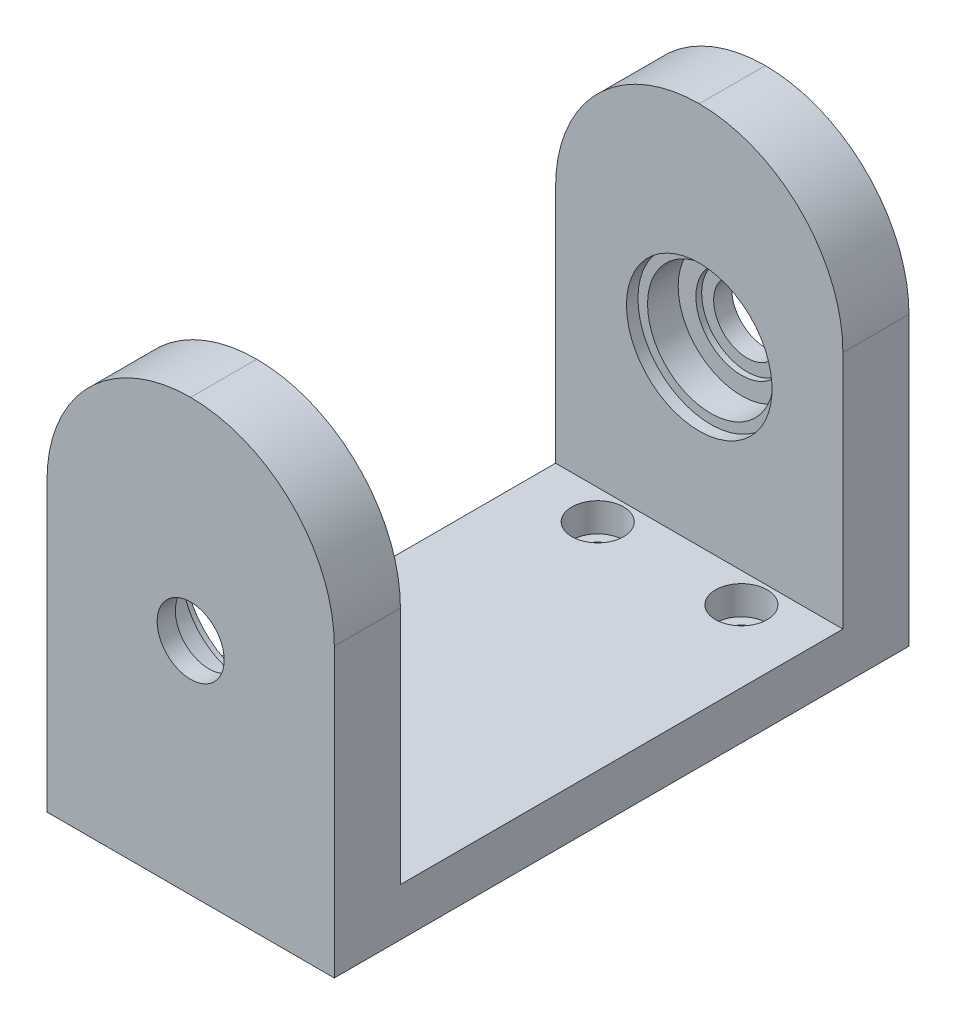
ISO-10303-21;
HEADER;
FILE_DESCRIPTION(('STEP AP214'),'2;1');
FILE_NAME('part.step','',(''),(''),'','','');
FILE_SCHEMA(('AUTOMOTIVE_DESIGN { 1 0 10303 214 1 1 1 1 }'));
ENDSEC;
DATA;
#1=APPLICATION_CONTEXT('core data for automotive mechanical design processes');
#2=APPLICATION_PROTOCOL_DEFINITION('international standard','automotive_design',2000,#1);
#3=PRODUCT_CONTEXT('',#1,'mechanical');
#4=PRODUCT('Part','Part','',(#3));
#5=PRODUCT_RELATED_PRODUCT_CATEGORY('part','',(#4));
#6=PRODUCT_DEFINITION_FORMATION('','',#4);
#7=PRODUCT_DEFINITION_CONTEXT('part definition',#1,'design');
#8=PRODUCT_DEFINITION('design','',#6,#7);
#9=PRODUCT_DEFINITION_SHAPE('','',#8);
#10=(LENGTH_UNIT() NAMED_UNIT(*) SI_UNIT(.MILLI.,.METRE.));
#11=(NAMED_UNIT(*) PLANE_ANGLE_UNIT() SI_UNIT($,.RADIAN.));
#12=(NAMED_UNIT(*) SI_UNIT($,.STERADIAN.) SOLID_ANGLE_UNIT());
#13=UNCERTAINTY_MEASURE_WITH_UNIT(LENGTH_MEASURE(1.E-05),#10,'distance_accuracy_value','');
#14=(GEOMETRIC_REPRESENTATION_CONTEXT(3) GLOBAL_UNCERTAINTY_ASSIGNED_CONTEXT((#13)) GLOBAL_UNIT_ASSIGNED_CONTEXT((#10,
#11,#12)) REPRESENTATION_CONTEXT('',''));
#15=CARTESIAN_POINT('',(0.,0.,0.));
#16=DIRECTION('',(0.,0.,1.));
#17=DIRECTION('',(1.,0.,0.));
#18=AXIS2_PLACEMENT_3D('',#15,#16,#17);
#19=CARTESIAN_POINT('',(-15.04416518748,12.7381812931289,2.68139476480281));
#20=DIRECTION('',(0.,1.,0.));
#21=DIRECTION('',(0.,0.,1.));
#22=AXIS2_PLACEMENT_3D('',#19,#20,#21);
#23=PLANE('',#22);
#24=CARTESIAN_POINT('',(-7.54416518748003,12.7381812931289,-17.3186052351972));
#25=DIRECTION('',(0.,1.,0.));
#26=DIRECTION('',(0.,0.,1.));
#27=AXIS2_PLACEMENT_3D('',#24,#25,#26);
#28=CIRCLE('',#27,2.7);
#29=CARTESIAN_POINT('',(-7.54416518748003,12.7381812931289,-14.6186052351972));
#30=VERTEX_POINT('',#29);
#31=EDGE_CURVE('E163',#30,#30,#28,.T.);
#32=ORIENTED_EDGE('',*,*,#31,.F.);
#33=EDGE_LOOP('',(#32));
#34=FACE_BOUND('',#33,.T.);
#35=CARTESIAN_POINT('',(-22.54416518748,12.7381812931289,22.6813947648028));
#36=DIRECTION('',(0.,1.,0.));
#37=DIRECTION('',(0.,0.,1.));
#38=AXIS2_PLACEMENT_3D('',#35,#36,#37);
#39=CIRCLE('',#38,2.7);
#40=CARTESIAN_POINT('',(-22.54416518748,12.7381812931289,25.3813947648028));
#41=VERTEX_POINT('',#40);
#42=EDGE_CURVE('E156',#41,#41,#39,.T.);
#43=ORIENTED_EDGE('',*,*,#42,.F.);
#44=EDGE_LOOP('',(#43));
#45=FACE_BOUND('',#44,.T.);
#46=CARTESIAN_POINT('',(-7.54416518748004,12.7381812931289,22.6813947648028));
#47=DIRECTION('',(0.,1.,0.));
#48=DIRECTION('',(0.,0.,1.));
#49=AXIS2_PLACEMENT_3D('',#46,#47,#48);
#50=CIRCLE('',#49,2.7);
#51=CARTESIAN_POINT('',(-7.54416518748004,12.7381812931289,25.3813947648028));
#52=VERTEX_POINT('',#51);
#53=EDGE_CURVE('E149',#52,#52,#50,.T.);
#54=ORIENTED_EDGE('',*,*,#53,.F.);
#55=EDGE_LOOP('',(#54));
#56=FACE_BOUND('',#55,.T.);
#57=CARTESIAN_POINT('',(-22.54416518748,12.7381812931289,-17.3186052351972));
#58=DIRECTION('',(0.,1.,0.));
#59=DIRECTION('',(0.,0.,1.));
#60=AXIS2_PLACEMENT_3D('',#57,#58,#59);
#61=CIRCLE('',#60,2.7);
#62=CARTESIAN_POINT('',(-22.54416518748,12.7381812931289,-14.6186052351972));
#63=VERTEX_POINT('',#62);
#64=EDGE_CURVE('E162',#63,#63,#61,.T.);
#65=ORIENTED_EDGE('',*,*,#64,.F.);
#66=EDGE_LOOP('',(#65));
#67=FACE_BOUND('',#66,.T.);
#68=DIRECTION('',(0.,0.,-1.));
#69=VECTOR('',#68,1.);
#70=CARTESIAN_POINT('',(-0.0441651874800303,12.7381812931289,32.6813947648028));
#71=LINE('',#70,#69);
#72=CARTESIAN_POINT('',(-0.0441651874800303,12.7381812931289,25.7813947648028));
#73=VERTEX_POINT('',#72);
#74=CARTESIAN_POINT('',(-0.0441651874800303,12.7381812931289,-20.4186052351972));
#75=VERTEX_POINT('',#74);
#76=EDGE_CURVE('E142',#73,#75,#71,.T.);
#77=ORIENTED_EDGE('',*,*,#76,.T.);
#78=DIRECTION('',(1.,0.,0.));
#79=VECTOR('',#78,1.);
#80=CARTESIAN_POINT('',(-30.04416518748,12.7381812931289,-20.4186052351972));
#81=LINE('',#80,#79);
#82=CARTESIAN_POINT('',(-30.04416518748,12.7381812931289,-20.4186052351972));
#83=VERTEX_POINT('',#82);
#84=EDGE_CURVE('E141',#83,#75,#81,.T.);
#85=ORIENTED_EDGE('',*,*,#84,.F.);
#86=DIRECTION('',(0.,0.,1.));
#87=VECTOR('',#86,1.);
#88=CARTESIAN_POINT('',(-30.04416518748,12.7381812931289,32.6813947648028));
#89=LINE('',#88,#87);
#90=CARTESIAN_POINT('',(-30.04416518748,12.7381812931289,25.7813947648028));
#91=VERTEX_POINT('',#90);
#92=EDGE_CURVE('E128',#83,#91,#89,.T.);
#93=ORIENTED_EDGE('',*,*,#92,.T.);
#94=DIRECTION('',(1.,0.,0.));
#95=VECTOR('',#94,1.);
#96=CARTESIAN_POINT('',(-30.04416518748,12.7381812931289,25.7813947648028));
#97=LINE('',#96,#95);
#98=EDGE_CURVE('E133',#91,#73,#97,.T.);
#99=ORIENTED_EDGE('',*,*,#98,.T.);
#100=EDGE_LOOP('',(#77,#85,#93,#99));
#101=FACE_BOUND('',#100,.T.);
#102=ADVANCED_FACE('F45',(#34,#45,#56,#67,#101),#23,.T.);
#103=CARTESIAN_POINT('',(-22.54416518748,12.7381812931289,-17.3186052351972));
#104=DIRECTION('',(0.,-1.,0.));
#105=DIRECTION('',(0.,0.,-1.));
#106=AXIS2_PLACEMENT_3D('',#103,#104,#105);
#107=CYLINDRICAL_SURFACE('',#106,1.65);
#108=CARTESIAN_POINT('',(-22.54416518748,7.73818129312892,-17.3186052351972));
#109=DIRECTION('',(0.,1.,0.));
#110=DIRECTION('',(0.,0.,1.));
#111=AXIS2_PLACEMENT_3D('',#108,#109,#110);
#112=CIRCLE('',#111,1.65);
#113=CARTESIAN_POINT('',(-22.54416518748,7.73818129312892,-15.6686052351972));
#114=VERTEX_POINT('',#113);
#115=EDGE_CURVE('E187',#114,#114,#112,.T.);
#116=ORIENTED_EDGE('',*,*,#115,.F.);
#117=EDGE_LOOP('',(#116));
#118=FACE_BOUND('',#117,.T.);
#119=CARTESIAN_POINT('',(-22.54416518748,9.73818129312892,-17.3186052351972));
#120=DIRECTION('',(0.,1.,0.));
#121=DIRECTION('',(0.,0.,1.));
#122=AXIS2_PLACEMENT_3D('',#119,#120,#121);
#123=CIRCLE('',#122,1.65);
#124=CARTESIAN_POINT('',(-22.54416518748,9.73818129312892,-15.6686052351972));
#125=VERTEX_POINT('',#124);
#126=EDGE_CURVE('E181',#125,#125,#123,.T.);
#127=ORIENTED_EDGE('',*,*,#126,.T.);
#128=EDGE_LOOP('',(#127));
#129=FACE_BOUND('',#128,.T.);
#130=ADVANCED_FACE('F349',(#118,#129),#107,.F.);
#131=CARTESIAN_POINT('',(-7.54416518748003,12.7381812931289,-17.3186052351972));
#132=DIRECTION('',(0.,-1.,0.));
#133=DIRECTION('',(0.,0.,-1.));
#134=AXIS2_PLACEMENT_3D('',#131,#132,#133);
#135=CYLINDRICAL_SURFACE('',#134,1.65);
#136=CARTESIAN_POINT('',(-7.54416518748003,7.73818129312892,-17.3186052351972));
#137=DIRECTION('',(0.,1.,0.));
#138=DIRECTION('',(0.,0.,-1.));
#139=AXIS2_PLACEMENT_3D('',#136,#137,#138);
#140=CIRCLE('',#139,1.65);
#141=CARTESIAN_POINT('',(-7.54416518748003,7.73818129312892,-18.9686052351972));
#142=VERTEX_POINT('',#141);
#143=EDGE_CURVE('E184',#142,#142,#140,.T.);
#144=ORIENTED_EDGE('',*,*,#143,.F.);
#145=EDGE_LOOP('',(#144));
#146=FACE_BOUND('',#145,.T.);
#147=CARTESIAN_POINT('',(-7.54416518748003,9.73818129312892,-17.3186052351972));
#148=DIRECTION('',(0.,1.,0.));
#149=DIRECTION('',(0.,0.,1.));
#150=AXIS2_PLACEMENT_3D('',#147,#148,#149);
#151=CIRCLE('',#150,1.65);
#152=CARTESIAN_POINT('',(-7.54416518748003,9.73818129312892,-15.6686052351972));
#153=VERTEX_POINT('',#152);
#154=EDGE_CURVE('E216',#153,#153,#151,.T.);
#155=ORIENTED_EDGE('',*,*,#154,.T.);
#156=EDGE_LOOP('',(#155));
#157=FACE_BOUND('',#156,.T.);
#158=ADVANCED_FACE('F355',(#146,#157),#135,.F.);
#159=CARTESIAN_POINT('',(-7.54416518748004,12.7381812931289,22.6813947648028));
#160=DIRECTION('',(0.,-1.,0.));
#161=DIRECTION('',(0.,0.,-1.));
#162=AXIS2_PLACEMENT_3D('',#159,#160,#161);
#163=CYLINDRICAL_SURFACE('',#162,1.65);
#164=CARTESIAN_POINT('',(-7.54416518748004,7.73818129312892,22.6813947648028));
#165=DIRECTION('',(0.,1.,0.));
#166=DIRECTION('',(0.,0.,1.));
#167=AXIS2_PLACEMENT_3D('',#164,#165,#166);
#168=CIRCLE('',#167,1.65);
#169=CARTESIAN_POINT('',(-7.54416518748004,7.73818129312892,24.3313947648028));
#170=VERTEX_POINT('',#169);
#171=EDGE_CURVE('E180',#170,#170,#168,.T.);
#172=ORIENTED_EDGE('',*,*,#171,.F.);
#173=EDGE_LOOP('',(#172));
#174=FACE_BOUND('',#173,.T.);
#175=CARTESIAN_POINT('',(-7.54416518748004,9.73818129312892,22.6813947648028));
#176=DIRECTION('',(0.,1.,0.));
#177=DIRECTION('',(0.,0.,1.));
#178=AXIS2_PLACEMENT_3D('',#175,#176,#177);
#179=CIRCLE('',#178,1.65);
#180=CARTESIAN_POINT('',(-7.54416518748004,9.73818129312892,24.3313947648028));
#181=VERTEX_POINT('',#180);
#182=EDGE_CURVE('E213',#181,#181,#179,.T.);
#183=ORIENTED_EDGE('',*,*,#182,.T.);
#184=EDGE_LOOP('',(#183));
#185=FACE_BOUND('',#184,.T.);
#186=ADVANCED_FACE('F705',(#174,#185),#163,.F.);
#187=CARTESIAN_POINT('',(-22.54416518748,12.7381812931289,22.6813947648028));
#188=DIRECTION('',(0.,-1.,0.));
#189=DIRECTION('',(0.,0.,-1.));
#190=AXIS2_PLACEMENT_3D('',#187,#188,#189);
#191=CYLINDRICAL_SURFACE('',#190,1.65);
#192=CARTESIAN_POINT('',(-22.54416518748,7.73818129312892,22.6813947648028));
#193=DIRECTION('',(0.,1.,0.));
#194=DIRECTION('',(0.,0.,-1.));
#195=AXIS2_PLACEMENT_3D('',#192,#193,#194);
#196=CIRCLE('',#195,1.65);
#197=CARTESIAN_POINT('',(-22.54416518748,7.73818129312892,21.0313947648028));
#198=VERTEX_POINT('',#197);
#199=EDGE_CURVE('E177',#198,#198,#196,.T.);
#200=ORIENTED_EDGE('',*,*,#199,.F.);
#201=EDGE_LOOP('',(#200));
#202=FACE_BOUND('',#201,.T.);
#203=CARTESIAN_POINT('',(-22.54416518748,9.73818129312892,22.6813947648028));
#204=DIRECTION('',(0.,1.,0.));
#205=DIRECTION('',(0.,0.,1.));
#206=AXIS2_PLACEMENT_3D('',#203,#204,#205);
#207=CIRCLE('',#206,1.65);
#208=CARTESIAN_POINT('',(-22.54416518748,9.73818129312892,24.3313947648028));
#209=VERTEX_POINT('',#208);
#210=EDGE_CURVE('E174',#209,#209,#207,.T.);
#211=ORIENTED_EDGE('',*,*,#210,.T.);
#212=EDGE_LOOP('',(#211));
#213=FACE_BOUND('',#212,.T.);
#214=ADVANCED_FACE('F365',(#202,#213),#191,.F.);
#215=CARTESIAN_POINT('',(-15.04416518748,7.73818129312892,2.68139476480281));
#216=DIRECTION('',(0.,1.,0.));
#217=DIRECTION('',(0.,0.,1.));
#218=AXIS2_PLACEMENT_3D('',#215,#216,#217);
#219=PLANE('',#218);
#220=DIRECTION('',(0.,0.,1.));
#221=VECTOR('',#220,1.);
#222=CARTESIAN_POINT('',(-30.04416518748,7.73818129312892,32.6813947648028));
#223=LINE('',#222,#221);
#224=CARTESIAN_POINT('',(-30.04416518748,7.73818129312892,-27.3186052351972));
#225=VERTEX_POINT('',#224);
#226=CARTESIAN_POINT('',(-30.04416518748,7.73818129312892,32.6813947648028));
#227=VERTEX_POINT('',#226);
#228=EDGE_CURVE('E189',#225,#227,#223,.T.);
#229=ORIENTED_EDGE('',*,*,#228,.F.);
#230=DIRECTION('',(-1.,0.,0.));
#231=VECTOR('',#230,1.);
#232=CARTESIAN_POINT('',(-0.0441651874800303,7.73818129312892,-27.3186052351972));
#233=LINE('',#232,#231);
#234=CARTESIAN_POINT('',(-0.0441651874800303,7.73818129312892,-27.3186052351972));
#235=VERTEX_POINT('',#234);
#236=EDGE_CURVE('E143',#235,#225,#233,.T.);
#237=ORIENTED_EDGE('',*,*,#236,.F.);
#238=DIRECTION('',(0.,0.,-1.));
#239=VECTOR('',#238,1.);
#240=CARTESIAN_POINT('',(-0.0441651874800303,7.73818129312892,32.6813947648028));
#241=LINE('',#240,#239);
#242=CARTESIAN_POINT('',(-0.0441651874800303,7.73818129312892,32.6813947648028));
#243=VERTEX_POINT('',#242);
#244=EDGE_CURVE('E198',#243,#235,#241,.T.);
#245=ORIENTED_EDGE('',*,*,#244,.F.);
#246=DIRECTION('',(1.,0.,0.));
#247=VECTOR('',#246,1.);
#248=CARTESIAN_POINT('',(-0.0441651874800303,7.73818129312892,32.6813947648028));
#249=LINE('',#248,#247);
#250=EDGE_CURVE('E195',#227,#243,#249,.T.);
#251=ORIENTED_EDGE('',*,*,#250,.F.);
#252=EDGE_LOOP('',(#229,#237,#245,#251));
#253=FACE_BOUND('',#252,.T.);
#254=ORIENTED_EDGE('',*,*,#115,.T.);
#255=EDGE_LOOP('',(#254));
#256=FACE_BOUND('',#255,.T.);
#257=ORIENTED_EDGE('',*,*,#143,.T.);
#258=EDGE_LOOP('',(#257));
#259=FACE_BOUND('',#258,.T.);
#260=ORIENTED_EDGE('',*,*,#171,.T.);
#261=EDGE_LOOP('',(#260));
#262=FACE_BOUND('',#261,.T.);
#263=ORIENTED_EDGE('',*,*,#199,.T.);
#264=EDGE_LOOP('',(#263));
#265=FACE_BOUND('',#264,.T.);
#266=ADVANCED_FACE('F362',(#253,#256,#259,#262,#265),#219,.F.);
#267=CARTESIAN_POINT('',(-30.04416518748,12.7381812931289,32.6813947648028));
#268=DIRECTION('',(1.,0.,0.));
#269=DIRECTION('',(0.,0.,-1.));
#270=AXIS2_PLACEMENT_3D('',#267,#268,#269);
#271=PLANE('',#270);
#272=DIRECTION('',(0.,-1.,0.));
#273=VECTOR('',#272,1.);
#274=CARTESIAN_POINT('',(-30.04416518748,12.7381812931289,-20.4186052351972));
#275=LINE('',#274,#273);
#276=CARTESIAN_POINT('',(-30.04416518748,37.7381812931289,-20.4186052351972));
#277=VERTEX_POINT('',#276);
#278=EDGE_CURVE('E307',#277,#83,#275,.T.);
#279=ORIENTED_EDGE('',*,*,#278,.F.);
#280=DIRECTION('',(0.,0.,-1.));
#281=VECTOR('',#280,1.);
#282=CARTESIAN_POINT('',(-30.04416518748,37.7381812931289,32.6813947648028));
#283=LINE('',#282,#281);
#284=CARTESIAN_POINT('',(-30.04416518748,37.7381812931289,-27.3186052351972));
#285=VERTEX_POINT('',#284);
#286=EDGE_CURVE('E234',#277,#285,#283,.T.);
#287=ORIENTED_EDGE('',*,*,#286,.T.);
#288=DIRECTION('',(0.,-1.,0.));
#289=VECTOR('',#288,1.);
#290=CARTESIAN_POINT('',(-30.04416518748,12.7381812931289,-27.3186052351972));
#291=LINE('',#290,#289);
#292=EDGE_CURVE('E192',#285,#225,#291,.T.);
#293=ORIENTED_EDGE('',*,*,#292,.T.);
#294=ORIENTED_EDGE('',*,*,#228,.T.);
#295=DIRECTION('',(0.,-1.,0.));
#296=VECTOR('',#295,1.);
#297=CARTESIAN_POINT('',(-30.04416518748,12.7381812931289,32.6813947648028));
#298=LINE('',#297,#296);
#299=CARTESIAN_POINT('',(-30.04416518748,37.7381812931289,32.6813947648028));
#300=VERTEX_POINT('',#299);
#301=EDGE_CURVE('E208',#300,#227,#298,.T.);
#302=ORIENTED_EDGE('',*,*,#301,.F.);
#303=DIRECTION('',(0.,0.,1.));
#304=VECTOR('',#303,1.);
#305=CARTESIAN_POINT('',(-30.04416518748,37.7381812931289,25.7813947648028));
#306=LINE('',#305,#304);
#307=CARTESIAN_POINT('',(-30.04416518748,37.7381812931289,25.7813947648028));
#308=VERTEX_POINT('',#307);
#309=EDGE_CURVE('E131',#300,#308,#306,.F.);
#310=ORIENTED_EDGE('',*,*,#309,.T.);
#311=DIRECTION('',(0.,-1.,0.));
#312=VECTOR('',#311,1.);
#313=CARTESIAN_POINT('',(-30.04416518748,12.7381812931289,25.7813947648028));
#314=LINE('',#313,#312);
#315=EDGE_CURVE('E124',#308,#91,#314,.T.);
#316=ORIENTED_EDGE('',*,*,#315,.T.);
#317=ORIENTED_EDGE('',*,*,#92,.F.);
#318=EDGE_LOOP('',(#279,#287,#293,#294,#302,#310,#316,#317));
#319=FACE_BOUND('',#318,.T.);
#320=ADVANCED_FACE('F127',(#319),#271,.F.);
#321=CARTESIAN_POINT('',(-0.0441651874800303,12.7381812931289,32.6813947648028));
#322=DIRECTION('',(0.,0.,-1.));
#323=DIRECTION('',(-1.,0.,0.));
#324=AXIS2_PLACEMENT_3D('',#321,#322,#323);
#325=PLANE('',#324);
#326=CARTESIAN_POINT('',(-15.04416518748,30.7381812931289,32.6813947648028));
#327=DIRECTION('',(0.,0.,-1.));
#328=DIRECTION('',(-1.,0.,0.));
#329=AXIS2_PLACEMENT_3D('',#326,#327,#328);
#330=CIRCLE('',#329,3.5);
#331=CARTESIAN_POINT('',(-18.54416518748,30.7381812931289,32.6813947648028));
#332=VERTEX_POINT('',#331);
#333=EDGE_CURVE('E254',#332,#332,#330,.T.);
#334=ORIENTED_EDGE('',*,*,#333,.T.);
#335=EDGE_LOOP('',(#334));
#336=FACE_BOUND('',#335,.T.);
#337=CARTESIAN_POINT('',(-15.04416518748,37.7381812931289,32.6813947648028));
#338=DIRECTION('',(0.,0.,-1.));
#339=DIRECTION('',(-1.,0.,0.));
#340=AXIS2_PLACEMENT_3D('',#337,#338,#339);
#341=CIRCLE('',#340,15.);
#342=CARTESIAN_POINT('',(-0.0441651874800303,37.7381812931289,32.6813947648028));
#343=VERTEX_POINT('',#342);
#344=CARTESIAN_POINT('',(-15.04416518748,52.7381812931289,32.6813947648028));
#345=VERTEX_POINT('',#344);
#346=EDGE_CURVE('E69',#343,#345,#341,.F.);
#347=ORIENTED_EDGE('',*,*,#346,.T.);
#348=CARTESIAN_POINT('',(-15.04416518748,37.7381812931289,32.6813947648028));
#349=DIRECTION('',(0.,0.,-1.));
#350=DIRECTION('',(-1.,0.,0.));
#351=AXIS2_PLACEMENT_3D('',#348,#349,#350);
#352=CIRCLE('',#351,15.);
#353=EDGE_CURVE('E237',#345,#300,#352,.F.);
#354=ORIENTED_EDGE('',*,*,#353,.T.);
#355=ORIENTED_EDGE('',*,*,#301,.T.);
#356=ORIENTED_EDGE('',*,*,#250,.T.);
#357=DIRECTION('',(0.,-1.,0.));
#358=VECTOR('',#357,1.);
#359=CARTESIAN_POINT('',(-0.0441651874800303,12.7381812931289,32.6813947648028));
#360=LINE('',#359,#358);
#361=EDGE_CURVE('E206',#343,#243,#360,.T.);
#362=ORIENTED_EDGE('',*,*,#361,.F.);
#363=EDGE_LOOP('',(#347,#354,#355,#356,#362));
#364=FACE_BOUND('',#363,.T.);
#365=ADVANCED_FACE('F373',(#336,#364),#325,.F.);
#366=CARTESIAN_POINT('',(-0.0441651874800303,12.7381812931289,32.6813947648028));
#367=DIRECTION('',(-1.,0.,0.));
#368=DIRECTION('',(0.,0.,1.));
#369=AXIS2_PLACEMENT_3D('',#366,#367,#368);
#370=PLANE('',#369);
#371=DIRECTION('',(0.,-1.,0.));
#372=VECTOR('',#371,1.);
#373=CARTESIAN_POINT('',(-0.0441651874800303,12.7381812931289,-27.3186052351972));
#374=LINE('',#373,#372);
#375=CARTESIAN_POINT('',(-0.0441651874800303,37.7381812931289,-27.3186052351972));
#376=VERTEX_POINT('',#375);
#377=EDGE_CURVE('E204',#376,#235,#374,.T.);
#378=ORIENTED_EDGE('',*,*,#377,.F.);
#379=DIRECTION('',(0.,0.,-1.));
#380=VECTOR('',#379,1.);
#381=CARTESIAN_POINT('',(-0.0441651874800303,37.7381812931289,32.6813947648028));
#382=LINE('',#381,#380);
#383=CARTESIAN_POINT('',(-0.0441651874800303,37.7381812931289,-20.4186052351972));
#384=VERTEX_POINT('',#383);
#385=EDGE_CURVE('E226',#376,#384,#382,.F.);
#386=ORIENTED_EDGE('',*,*,#385,.T.);
#387=DIRECTION('',(0.,1.,0.));
#388=VECTOR('',#387,1.);
#389=CARTESIAN_POINT('',(-0.0441651874800303,32.7381812931289,-20.4186052351972));
#390=LINE('',#389,#388);
#391=EDGE_CURVE('E311',#75,#384,#390,.T.);
#392=ORIENTED_EDGE('',*,*,#391,.F.);
#393=ORIENTED_EDGE('',*,*,#76,.F.);
#394=DIRECTION('',(0.,1.,0.));
#395=VECTOR('',#394,1.);
#396=CARTESIAN_POINT('',(-0.0441651874800303,12.7381812931289,25.7813947648028));
#397=LINE('',#396,#395);
#398=CARTESIAN_POINT('',(-0.0441651874800303,37.7381812931289,25.7813947648028));
#399=VERTEX_POINT('',#398);
#400=EDGE_CURVE('E147',#73,#399,#397,.T.);
#401=ORIENTED_EDGE('',*,*,#400,.T.);
#402=DIRECTION('',(0.,0.,1.));
#403=VECTOR('',#402,1.);
#404=CARTESIAN_POINT('',(-0.0441651874800303,37.7381812931289,32.6813947648028));
#405=LINE('',#404,#403);
#406=EDGE_CURVE('E224',#399,#343,#405,.T.);
#407=ORIENTED_EDGE('',*,*,#406,.T.);
#408=ORIENTED_EDGE('',*,*,#361,.T.);
#409=ORIENTED_EDGE('',*,*,#244,.T.);
#410=EDGE_LOOP('',(#378,#386,#392,#393,#401,#407,#408,#409));
#411=FACE_BOUND('',#410,.T.);
#412=ADVANCED_FACE('F370',(#411),#370,.F.);
#413=CARTESIAN_POINT('',(-0.0441651874800303,12.7381812931289,-27.3186052351972));
#414=DIRECTION('',(0.,0.,1.));
#415=DIRECTION('',(1.,0.,0.));
#416=AXIS2_PLACEMENT_3D('',#413,#414,#415);
#417=PLANE('',#416);
#418=CARTESIAN_POINT('',(-24.56916518748,30.7381812931289,-27.3186052351972));
#419=DIRECTION('',(0.,0.,1.));
#420=DIRECTION('',(1.,0.,0.));
#421=AXIS2_PLACEMENT_3D('',#418,#419,#420);
#422=CIRCLE('',#421,1.95);
#423=CARTESIAN_POINT('',(-22.61916518748,30.7381812931289,-27.3186052351972));
#424=VERTEX_POINT('',#423);
#425=EDGE_CURVE('E54',#424,#424,#422,.T.);
#426=ORIENTED_EDGE('',*,*,#425,.T.);
#427=EDGE_LOOP('',(#426));
#428=FACE_BOUND('',#427,.T.);
#429=CARTESIAN_POINT('',(-5.51916518748003,30.7381812931289,-27.3186052351972));
#430=DIRECTION('',(0.,0.,1.));
#431=DIRECTION('',(1.,0.,0.));
#432=AXIS2_PLACEMENT_3D('',#429,#430,#431);
#433=CIRCLE('',#432,1.95);
#434=CARTESIAN_POINT('',(-3.56916518748003,30.7381812931289,-27.3186052351972));
#435=VERTEX_POINT('',#434);
#436=EDGE_CURVE('E257',#435,#435,#433,.T.);
#437=ORIENTED_EDGE('',*,*,#436,.T.);
#438=EDGE_LOOP('',(#437));
#439=FACE_BOUND('',#438,.T.);
#440=CARTESIAN_POINT('',(-15.04416518748,30.7381812931289,-27.3186052351972));
#441=DIRECTION('',(0.,0.,-1.));
#442=DIRECTION('',(-1.,0.,0.));
#443=AXIS2_PLACEMENT_3D('',#440,#441,#442);
#444=CIRCLE('',#443,3.5);
#445=CARTESIAN_POINT('',(-18.54416518748,30.7381812931289,-27.3186052351972));
#446=VERTEX_POINT('',#445);
#447=EDGE_CURVE('E283',#446,#446,#444,.T.);
#448=ORIENTED_EDGE('',*,*,#447,.F.);
#449=EDGE_LOOP('',(#448));
#450=FACE_BOUND('',#449,.T.);
#451=CARTESIAN_POINT('',(-15.04416518748,37.7381812931289,-27.3186052351972));
#452=DIRECTION('',(0.,0.,1.));
#453=DIRECTION('',(1.,0.,0.));
#454=AXIS2_PLACEMENT_3D('',#451,#452,#453);
#455=CIRCLE('',#454,15.);
#456=CARTESIAN_POINT('',(-15.04416518748,52.7381812931289,-27.3186052351972));
#457=VERTEX_POINT('',#456);
#458=EDGE_CURVE('E210',#285,#457,#455,.F.);
#459=ORIENTED_EDGE('',*,*,#458,.T.);
#460=CARTESIAN_POINT('',(-15.04416518748,37.7381812931289,-27.3186052351972));
#461=DIRECTION('',(0.,0.,1.));
#462=DIRECTION('',(1.,0.,0.));
#463=AXIS2_PLACEMENT_3D('',#460,#461,#462);
#464=CIRCLE('',#463,15.);
#465=EDGE_CURVE('E222',#457,#376,#464,.F.);
#466=ORIENTED_EDGE('',*,*,#465,.T.);
#467=ORIENTED_EDGE('',*,*,#377,.T.);
#468=ORIENTED_EDGE('',*,*,#236,.T.);
#469=ORIENTED_EDGE('',*,*,#292,.F.);
#470=EDGE_LOOP('',(#459,#466,#467,#468,#469));
#471=FACE_BOUND('',#470,.T.);
#472=ADVANCED_FACE('F262',(#428,#439,#450,#471),#417,.F.);
#473=CARTESIAN_POINT('',(-22.54416518748,9.73818129312892,22.6813947648028));
#474=DIRECTION('',(0.,1.,0.));
#475=DIRECTION('',(0.,0.,1.));
#476=AXIS2_PLACEMENT_3D('',#473,#474,#475);
#477=CYLINDRICAL_SURFACE('',#476,2.7);
#478=CARTESIAN_POINT('',(-22.54416518748,9.73818129312892,22.6813947648028));
#479=DIRECTION('',(0.,1.,0.));
#480=DIRECTION('',(0.,0.,1.));
#481=AXIS2_PLACEMENT_3D('',#478,#479,#480);
#482=CIRCLE('',#481,2.7);
#483=CARTESIAN_POINT('',(-22.54416518748,9.73818129312892,25.3813947648028));
#484=VERTEX_POINT('',#483);
#485=EDGE_CURVE('E166',#484,#484,#482,.T.);
#486=ORIENTED_EDGE('',*,*,#485,.F.);
#487=EDGE_LOOP('',(#486));
#488=FACE_BOUND('',#487,.T.);
#489=ORIENTED_EDGE('',*,*,#42,.T.);
#490=EDGE_LOOP('',(#489));
#491=FACE_BOUND('',#490,.T.);
#492=ADVANCED_FACE('F369',(#488,#491),#477,.F.);
#493=CARTESIAN_POINT('',(-22.54416518748,9.73818129312892,22.6813947648028));
#494=DIRECTION('',(0.,1.,0.));
#495=DIRECTION('',(0.,0.,1.));
#496=AXIS2_PLACEMENT_3D('',#493,#494,#495);
#497=PLANE('',#496);
#498=ORIENTED_EDGE('',*,*,#210,.F.);
#499=EDGE_LOOP('',(#498));
#500=FACE_BOUND('',#499,.T.);
#501=ORIENTED_EDGE('',*,*,#485,.T.);
#502=EDGE_LOOP('',(#501));
#503=FACE_BOUND('',#502,.T.);
#504=ADVANCED_FACE('F679',(#500,#503),#497,.T.);
#505=CARTESIAN_POINT('',(-7.54416518748004,9.73818129312892,22.6813947648028));
#506=DIRECTION('',(0.,1.,0.));
#507=DIRECTION('',(0.,0.,1.));
#508=AXIS2_PLACEMENT_3D('',#505,#506,#507);
#509=CYLINDRICAL_SURFACE('',#508,2.7);
#510=CARTESIAN_POINT('',(-7.54416518748004,9.73818129312892,22.6813947648028));
#511=DIRECTION('',(0.,1.,0.));
#512=DIRECTION('',(0.,0.,1.));
#513=AXIS2_PLACEMENT_3D('',#510,#511,#512);
#514=CIRCLE('',#513,2.7);
#515=CARTESIAN_POINT('',(-7.54416518748004,9.73818129312892,25.3813947648028));
#516=VERTEX_POINT('',#515);
#517=EDGE_CURVE('E153',#516,#516,#514,.T.);
#518=ORIENTED_EDGE('',*,*,#517,.F.);
#519=EDGE_LOOP('',(#518));
#520=FACE_BOUND('',#519,.T.);
#521=ORIENTED_EDGE('',*,*,#53,.T.);
#522=EDGE_LOOP('',(#521));
#523=FACE_BOUND('',#522,.T.);
#524=ADVANCED_FACE('F671',(#520,#523),#509,.F.);
#525=CARTESIAN_POINT('',(-7.54416518748004,9.73818129312892,22.6813947648028));
#526=DIRECTION('',(0.,1.,0.));
#527=DIRECTION('',(0.,0.,1.));
#528=AXIS2_PLACEMENT_3D('',#525,#526,#527);
#529=PLANE('',#528);
#530=ORIENTED_EDGE('',*,*,#182,.F.);
#531=EDGE_LOOP('',(#530));
#532=FACE_BOUND('',#531,.T.);
#533=ORIENTED_EDGE('',*,*,#517,.T.);
#534=EDGE_LOOP('',(#533));
#535=FACE_BOUND('',#534,.T.);
#536=ADVANCED_FACE('F662',(#532,#535),#529,.T.);
#537=CARTESIAN_POINT('',(-7.54416518748003,9.73818129312892,-17.3186052351972));
#538=DIRECTION('',(0.,1.,0.));
#539=DIRECTION('',(0.,0.,1.));
#540=AXIS2_PLACEMENT_3D('',#537,#538,#539);
#541=CYLINDRICAL_SURFACE('',#540,2.7);
#542=CARTESIAN_POINT('',(-7.54416518748003,9.73818129312892,-17.3186052351972));
#543=DIRECTION('',(0.,1.,0.));
#544=DIRECTION('',(0.,0.,1.));
#545=AXIS2_PLACEMENT_3D('',#542,#543,#544);
#546=CIRCLE('',#545,2.7);
#547=CARTESIAN_POINT('',(-7.54416518748003,9.73818129312892,-14.6186052351972));
#548=VERTEX_POINT('',#547);
#549=EDGE_CURVE('E159',#548,#548,#546,.T.);
#550=ORIENTED_EDGE('',*,*,#549,.F.);
#551=EDGE_LOOP('',(#550));
#552=FACE_BOUND('',#551,.T.);
#553=ORIENTED_EDGE('',*,*,#31,.T.);
#554=EDGE_LOOP('',(#553));
#555=FACE_BOUND('',#554,.T.);
#556=ADVANCED_FACE('F653',(#552,#555),#541,.F.);
#557=CARTESIAN_POINT('',(-7.54416518748003,9.73818129312892,-17.3186052351972));
#558=DIRECTION('',(0.,1.,0.));
#559=DIRECTION('',(0.,0.,1.));
#560=AXIS2_PLACEMENT_3D('',#557,#558,#559);
#561=PLANE('',#560);
#562=ORIENTED_EDGE('',*,*,#154,.F.);
#563=EDGE_LOOP('',(#562));
#564=FACE_BOUND('',#563,.T.);
#565=ORIENTED_EDGE('',*,*,#549,.T.);
#566=EDGE_LOOP('',(#565));
#567=FACE_BOUND('',#566,.T.);
#568=ADVANCED_FACE('F643',(#564,#567),#561,.T.);
#569=CARTESIAN_POINT('',(-22.54416518748,9.73818129312892,-17.3186052351972));
#570=DIRECTION('',(0.,1.,0.));
#571=DIRECTION('',(0.,0.,1.));
#572=AXIS2_PLACEMENT_3D('',#569,#570,#571);
#573=CYLINDRICAL_SURFACE('',#572,2.7);
#574=CARTESIAN_POINT('',(-22.54416518748,9.73818129312892,-17.3186052351972));
#575=DIRECTION('',(0.,1.,0.));
#576=DIRECTION('',(0.,0.,1.));
#577=AXIS2_PLACEMENT_3D('',#574,#575,#576);
#578=CIRCLE('',#577,2.7);
#579=CARTESIAN_POINT('',(-22.54416518748,9.73818129312892,-14.6186052351972));
#580=VERTEX_POINT('',#579);
#581=EDGE_CURVE('E171',#580,#580,#578,.T.);
#582=ORIENTED_EDGE('',*,*,#581,.F.);
#583=EDGE_LOOP('',(#582));
#584=FACE_BOUND('',#583,.T.);
#585=ORIENTED_EDGE('',*,*,#64,.T.);
#586=EDGE_LOOP('',(#585));
#587=FACE_BOUND('',#586,.T.);
#588=ADVANCED_FACE('F344',(#584,#587),#573,.F.);
#589=CARTESIAN_POINT('',(-22.54416518748,9.73818129312892,-17.3186052351972));
#590=DIRECTION('',(0.,1.,0.));
#591=DIRECTION('',(0.,0.,1.));
#592=AXIS2_PLACEMENT_3D('',#589,#590,#591);
#593=PLANE('',#592);
#594=ORIENTED_EDGE('',*,*,#126,.F.);
#595=EDGE_LOOP('',(#594));
#596=FACE_BOUND('',#595,.T.);
#597=ORIENTED_EDGE('',*,*,#581,.T.);
#598=EDGE_LOOP('',(#597));
#599=FACE_BOUND('',#598,.T.);
#600=ADVANCED_FACE('F335',(#596,#599),#593,.T.);
#601=CARTESIAN_POINT('',(-15.04416518748,7.73818129312892,25.7813947648028));
#602=DIRECTION('',(0.,0.,1.));
#603=DIRECTION('',(1.,0.,0.));
#604=AXIS2_PLACEMENT_3D('',#601,#602,#603);
#605=PLANE('',#604);
#606=CARTESIAN_POINT('',(-15.04416518748,30.7381812931289,25.7813947648028));
#607=DIRECTION('',(0.,0.,-1.));
#608=DIRECTION('',(-1.,0.,0.));
#609=AXIS2_PLACEMENT_3D('',#606,#607,#608);
#610=CIRCLE('',#609,7.60000000000001);
#611=CARTESIAN_POINT('',(-22.64416518748,30.7381812931289,25.7813947648028));
#612=VERTEX_POINT('',#611);
#613=EDGE_CURVE('E325',#612,#612,#610,.T.);
#614=ORIENTED_EDGE('',*,*,#613,.F.);
#615=EDGE_LOOP('',(#614));
#616=FACE_BOUND('',#615,.T.);
#617=ORIENTED_EDGE('',*,*,#315,.F.);
#618=CARTESIAN_POINT('',(-15.04416518748,37.7381812931289,25.7813947648028));
#619=DIRECTION('',(0.,0.,1.));
#620=DIRECTION('',(1.,0.,0.));
#621=AXIS2_PLACEMENT_3D('',#618,#619,#620);
#622=CIRCLE('',#621,15.);
#623=CARTESIAN_POINT('',(-15.04416518748,52.7381812931289,25.7813947648028));
#624=VERTEX_POINT('',#623);
#625=EDGE_CURVE('E61',#308,#624,#622,.F.);
#626=ORIENTED_EDGE('',*,*,#625,.T.);
#627=CARTESIAN_POINT('',(-15.04416518748,37.7381812931289,25.7813947648028));
#628=DIRECTION('',(0.,0.,1.));
#629=DIRECTION('',(1.,0.,0.));
#630=AXIS2_PLACEMENT_3D('',#627,#628,#629);
#631=CIRCLE('',#630,15.);
#632=EDGE_CURVE('E239',#624,#399,#631,.F.);
#633=ORIENTED_EDGE('',*,*,#632,.T.);
#634=ORIENTED_EDGE('',*,*,#400,.F.);
#635=ORIENTED_EDGE('',*,*,#98,.F.);
#636=EDGE_LOOP('',(#617,#626,#633,#634,#635));
#637=FACE_BOUND('',#636,.T.);
#638=ADVANCED_FACE('F145',(#616,#637),#605,.F.);
#639=CARTESIAN_POINT('',(-15.04416518748,30.7381812931289,26.9813947648028));
#640=DIRECTION('',(0.,0.,-1.));
#641=DIRECTION('',(-1.,0.,0.));
#642=AXIS2_PLACEMENT_3D('',#639,#640,#641);
#643=CYLINDRICAL_SURFACE('',#642,7.60000000000001);
#644=CARTESIAN_POINT('',(-15.04416518748,30.7381812931289,26.9813947648028));
#645=DIRECTION('',(0.,0.,-1.));
#646=DIRECTION('',(-1.,0.,0.));
#647=AXIS2_PLACEMENT_3D('',#644,#645,#646);
#648=CIRCLE('',#647,7.60000000000001);
#649=CARTESIAN_POINT('',(-22.64416518748,30.7381812931289,26.9813947648028));
#650=VERTEX_POINT('',#649);
#651=EDGE_CURVE('E134',#650,#650,#648,.T.);
#652=ORIENTED_EDGE('',*,*,#651,.F.);
#653=EDGE_LOOP('',(#652));
#654=FACE_BOUND('',#653,.T.);
#655=ORIENTED_EDGE('',*,*,#613,.T.);
#656=EDGE_LOOP('',(#655));
#657=FACE_BOUND('',#656,.T.);
#658=ADVANCED_FACE('F332',(#654,#657),#643,.F.);
#659=CARTESIAN_POINT('',(-15.04416518748,30.7381812931289,26.9813947648028));
#660=DIRECTION('',(0.,0.,-1.));
#661=DIRECTION('',(-1.,0.,0.));
#662=AXIS2_PLACEMENT_3D('',#659,#660,#661);
#663=PLANE('',#662);
#664=CARTESIAN_POINT('',(-15.04416518748,30.7381812931289,26.9813947648028));
#665=DIRECTION('',(0.,0.,-1.));
#666=DIRECTION('',(-1.,0.,0.));
#667=AXIS2_PLACEMENT_3D('',#664,#665,#666);
#668=CIRCLE('',#667,6.6);
#669=CARTESIAN_POINT('',(-21.64416518748,30.7381812931289,26.9813947648028));
#670=VERTEX_POINT('',#669);
#671=EDGE_CURVE('E319',#670,#670,#668,.T.);
#672=ORIENTED_EDGE('',*,*,#671,.F.);
#673=EDGE_LOOP('',(#672));
#674=FACE_BOUND('',#673,.T.);
#675=ORIENTED_EDGE('',*,*,#651,.T.);
#676=EDGE_LOOP('',(#675));
#677=FACE_BOUND('',#676,.T.);
#678=ADVANCED_FACE('F341',(#674,#677),#663,.T.);
#679=CARTESIAN_POINT('',(-15.04416518748,30.7381812931289,30.1813947648028));
#680=DIRECTION('',(0.,0.,-1.));
#681=DIRECTION('',(-1.,0.,0.));
#682=AXIS2_PLACEMENT_3D('',#679,#680,#681);
#683=CYLINDRICAL_SURFACE('',#682,6.6);
#684=CARTESIAN_POINT('',(-15.04416518748,30.7381812931289,30.1813947648028));
#685=DIRECTION('',(0.,0.,-1.));
#686=DIRECTION('',(-1.,0.,0.));
#687=AXIS2_PLACEMENT_3D('',#684,#685,#686);
#688=CIRCLE('',#687,6.6);
#689=CARTESIAN_POINT('',(-21.64416518748,30.7381812931289,30.1813947648028));
#690=VERTEX_POINT('',#689);
#691=EDGE_CURVE('E322',#690,#690,#688,.T.);
#692=ORIENTED_EDGE('',*,*,#691,.F.);
#693=EDGE_LOOP('',(#692));
#694=FACE_BOUND('',#693,.T.);
#695=ORIENTED_EDGE('',*,*,#671,.T.);
#696=EDGE_LOOP('',(#695));
#697=FACE_BOUND('',#696,.T.);
#698=ADVANCED_FACE('F446',(#694,#697),#683,.F.);
#699=CARTESIAN_POINT('',(-15.04416518748,30.7381812931289,30.1813947648028));
#700=DIRECTION('',(0.,0.,-1.));
#701=DIRECTION('',(-1.,0.,0.));
#702=AXIS2_PLACEMENT_3D('',#699,#700,#701);
#703=PLANE('',#702);
#704=CARTESIAN_POINT('',(-15.04416518748,30.7381812931289,30.1813947648028));
#705=DIRECTION('',(0.,0.,-1.));
#706=DIRECTION('',(-1.,0.,0.));
#707=AXIS2_PLACEMENT_3D('',#704,#705,#706);
#708=CIRCLE('',#707,4.75);
#709=CARTESIAN_POINT('',(-19.79416518748,30.7381812931289,30.1813947648028));
#710=VERTEX_POINT('',#709);
#711=EDGE_CURVE('E315',#710,#710,#708,.T.);
#712=ORIENTED_EDGE('',*,*,#711,.F.);
#713=EDGE_LOOP('',(#712));
#714=FACE_BOUND('',#713,.T.);
#715=ORIENTED_EDGE('',*,*,#691,.T.);
#716=EDGE_LOOP('',(#715));
#717=FACE_BOUND('',#716,.T.);
#718=ADVANCED_FACE('F442',(#714,#717),#703,.T.);
#719=CARTESIAN_POINT('',(-15.04416518748,30.7381812931289,30.7813947648028));
#720=DIRECTION('',(0.,0.,-1.));
#721=DIRECTION('',(-1.,0.,0.));
#722=AXIS2_PLACEMENT_3D('',#719,#720,#721);
#723=CYLINDRICAL_SURFACE('',#722,4.75);
#724=CARTESIAN_POINT('',(-15.04416518748,30.7381812931289,30.7813947648028));
#725=DIRECTION('',(0.,0.,-1.));
#726=DIRECTION('',(-1.,0.,0.));
#727=AXIS2_PLACEMENT_3D('',#724,#725,#726);
#728=CIRCLE('',#727,4.75);
#729=CARTESIAN_POINT('',(-19.79416518748,30.7381812931289,30.7813947648028));
#730=VERTEX_POINT('',#729);
#731=EDGE_CURVE('E316',#730,#730,#728,.T.);
#732=ORIENTED_EDGE('',*,*,#731,.F.);
#733=EDGE_LOOP('',(#732));
#734=FACE_BOUND('',#733,.T.);
#735=ORIENTED_EDGE('',*,*,#711,.T.);
#736=EDGE_LOOP('',(#735));
#737=FACE_BOUND('',#736,.T.);
#738=ADVANCED_FACE('F435',(#734,#737),#723,.F.);
#739=CARTESIAN_POINT('',(-15.04416518748,30.7381812931289,30.7813947648028));
#740=DIRECTION('',(0.,0.,-1.));
#741=DIRECTION('',(-1.,0.,0.));
#742=AXIS2_PLACEMENT_3D('',#739,#740,#741);
#743=PLANE('',#742);
#744=CARTESIAN_POINT('',(-15.04416518748,30.7381812931289,30.7813947648028));
#745=DIRECTION('',(0.,0.,-1.));
#746=DIRECTION('',(-1.,0.,0.));
#747=AXIS2_PLACEMENT_3D('',#744,#745,#746);
#748=CIRCLE('',#747,3.5);
#749=CARTESIAN_POINT('',(-18.54416518748,30.7381812931289,30.7813947648028));
#750=VERTEX_POINT('',#749);
#751=EDGE_CURVE('E250',#750,#750,#748,.T.);
#752=ORIENTED_EDGE('',*,*,#751,.F.);
#753=EDGE_LOOP('',(#752));
#754=FACE_BOUND('',#753,.T.);
#755=ORIENTED_EDGE('',*,*,#731,.T.);
#756=EDGE_LOOP('',(#755));
#757=FACE_BOUND('',#756,.T.);
#758=ADVANCED_FACE('F425',(#754,#757),#743,.T.);
#759=CARTESIAN_POINT('',(-15.04416518748,7.73818129312892,-20.4186052351972));
#760=DIRECTION('',(0.,0.,-1.));
#761=DIRECTION('',(1.,0.,0.));
#762=AXIS2_PLACEMENT_3D('',#759,#760,#761);
#763=PLANE('',#762);
#764=CARTESIAN_POINT('',(-15.04416518748,30.7381812931289,-20.4186052351972));
#765=DIRECTION('',(0.,0.,-1.));
#766=DIRECTION('',(-1.,0.,0.));
#767=AXIS2_PLACEMENT_3D('',#764,#765,#766);
#768=CIRCLE('',#767,7.60000000000001);
#769=CARTESIAN_POINT('',(-22.64416518748,30.7381812931289,-20.4186052351972));
#770=VERTEX_POINT('',#769);
#771=EDGE_CURVE('E301',#770,#770,#768,.T.);
#772=ORIENTED_EDGE('',*,*,#771,.T.);
#773=EDGE_LOOP('',(#772));
#774=FACE_BOUND('',#773,.T.);
#775=ORIENTED_EDGE('',*,*,#391,.T.);
#776=CARTESIAN_POINT('',(-15.04416518748,37.7381812931289,-20.4186052351972));
#777=DIRECTION('',(0.,0.,-1.));
#778=DIRECTION('',(-1.,0.,0.));
#779=AXIS2_PLACEMENT_3D('',#776,#777,#778);
#780=CIRCLE('',#779,15.);
#781=CARTESIAN_POINT('',(-15.04416518748,52.7381812931289,-20.4186052351972));
#782=VERTEX_POINT('',#781);
#783=EDGE_CURVE('E231',#384,#782,#780,.F.);
#784=ORIENTED_EDGE('',*,*,#783,.T.);
#785=CARTESIAN_POINT('',(-15.04416518748,37.7381812931289,-20.4186052351972));
#786=DIRECTION('',(0.,0.,-1.));
#787=DIRECTION('',(-1.,0.,0.));
#788=AXIS2_PLACEMENT_3D('',#785,#786,#787);
#789=CIRCLE('',#788,15.);
#790=EDGE_CURVE('E229',#782,#277,#789,.F.);
#791=ORIENTED_EDGE('',*,*,#790,.T.);
#792=ORIENTED_EDGE('',*,*,#278,.T.);
#793=ORIENTED_EDGE('',*,*,#84,.T.);
#794=EDGE_LOOP('',(#775,#784,#791,#792,#793));
#795=FACE_BOUND('',#794,.T.);
#796=ADVANCED_FACE('F418',(#774,#795),#763,.F.);
#797=CARTESIAN_POINT('',(-15.04416518748,30.7381812931289,-21.6186052351972));
#798=DIRECTION('',(0.,0.,1.));
#799=DIRECTION('',(1.,0.,0.));
#800=AXIS2_PLACEMENT_3D('',#797,#798,#799);
#801=CYLINDRICAL_SURFACE('',#800,7.60000000000001);
#802=CARTESIAN_POINT('',(-15.04416518748,30.7381812931289,-21.6186052351972));
#803=DIRECTION('',(0.,0.,-1.));
#804=DIRECTION('',(-1.,0.,0.));
#805=AXIS2_PLACEMENT_3D('',#802,#803,#804);
#806=CIRCLE('',#805,7.60000000000001);
#807=CARTESIAN_POINT('',(-22.64416518748,30.7381812931289,-21.6186052351972));
#808=VERTEX_POINT('',#807);
#809=EDGE_CURVE('E304',#808,#808,#806,.T.);
#810=ORIENTED_EDGE('',*,*,#809,.T.);
#811=EDGE_LOOP('',(#810));
#812=FACE_BOUND('',#811,.T.);
#813=ORIENTED_EDGE('',*,*,#771,.F.);
#814=EDGE_LOOP('',(#813));
#815=FACE_BOUND('',#814,.T.);
#816=ADVANCED_FACE('F424',(#812,#815),#801,.F.);
#817=CARTESIAN_POINT('',(-15.04416518748,30.7381812931289,-21.6186052351972));
#818=DIRECTION('',(0.,0.,1.));
#819=DIRECTION('',(-1.,0.,0.));
#820=AXIS2_PLACEMENT_3D('',#817,#818,#819);
#821=PLANE('',#820);
#822=CARTESIAN_POINT('',(-15.04416518748,30.7381812931289,-21.6186052351972));
#823=DIRECTION('',(0.,0.,-1.));
#824=DIRECTION('',(-1.,0.,0.));
#825=AXIS2_PLACEMENT_3D('',#822,#823,#824);
#826=CIRCLE('',#825,6.6);
#827=CARTESIAN_POINT('',(-21.64416518748,30.7381812931289,-21.6186052351972));
#828=VERTEX_POINT('',#827);
#829=EDGE_CURVE('E295',#828,#828,#826,.T.);
#830=ORIENTED_EDGE('',*,*,#829,.T.);
#831=EDGE_LOOP('',(#830));
#832=FACE_BOUND('',#831,.T.);
#833=ORIENTED_EDGE('',*,*,#809,.F.);
#834=EDGE_LOOP('',(#833));
#835=FACE_BOUND('',#834,.T.);
#836=ADVANCED_FACE('F432',(#832,#835),#821,.T.);
#837=CARTESIAN_POINT('',(-15.04416518748,30.7381812931289,-24.8186052351972));
#838=DIRECTION('',(0.,0.,1.));
#839=DIRECTION('',(1.,0.,0.));
#840=AXIS2_PLACEMENT_3D('',#837,#838,#839);
#841=CYLINDRICAL_SURFACE('',#840,6.6);
#842=CARTESIAN_POINT('',(-15.04416518748,30.7381812931289,-24.8186052351972));
#843=DIRECTION('',(0.,0.,-1.));
#844=DIRECTION('',(-1.,0.,0.));
#845=AXIS2_PLACEMENT_3D('',#842,#843,#844);
#846=CIRCLE('',#845,6.6);
#847=CARTESIAN_POINT('',(-21.64416518748,30.7381812931289,-24.8186052351972));
#848=VERTEX_POINT('',#847);
#849=EDGE_CURVE('E298',#848,#848,#846,.T.);
#850=ORIENTED_EDGE('',*,*,#849,.T.);
#851=EDGE_LOOP('',(#850));
#852=FACE_BOUND('',#851,.T.);
#853=ORIENTED_EDGE('',*,*,#829,.F.);
#854=EDGE_LOOP('',(#853));
#855=FACE_BOUND('',#854,.T.);
#856=ADVANCED_FACE('F502',(#852,#855),#841,.F.);
#857=CARTESIAN_POINT('',(-15.04416518748,30.7381812931289,-24.8186052351972));
#858=DIRECTION('',(0.,0.,1.));
#859=DIRECTION('',(-1.,0.,0.));
#860=AXIS2_PLACEMENT_3D('',#857,#858,#859);
#861=PLANE('',#860);
#862=CARTESIAN_POINT('',(-15.04416518748,30.7381812931289,-24.8186052351972));
#863=DIRECTION('',(0.,0.,-1.));
#864=DIRECTION('',(-1.,0.,0.));
#865=AXIS2_PLACEMENT_3D('',#862,#863,#864);
#866=CIRCLE('',#865,4.75);
#867=CARTESIAN_POINT('',(-19.79416518748,30.7381812931289,-24.8186052351972));
#868=VERTEX_POINT('',#867);
#869=EDGE_CURVE('E246',#868,#868,#866,.T.);
#870=ORIENTED_EDGE('',*,*,#869,.T.);
#871=EDGE_LOOP('',(#870));
#872=FACE_BOUND('',#871,.T.);
#873=ORIENTED_EDGE('',*,*,#849,.F.);
#874=EDGE_LOOP('',(#873));
#875=FACE_BOUND('',#874,.T.);
#876=ADVANCED_FACE('F511',(#872,#875),#861,.T.);
#877=CARTESIAN_POINT('',(-15.04416518748,30.7381812931289,-25.4186052351972));
#878=DIRECTION('',(0.,0.,1.));
#879=DIRECTION('',(1.,0.,0.));
#880=AXIS2_PLACEMENT_3D('',#877,#878,#879);
#881=CYLINDRICAL_SURFACE('',#880,4.75);
#882=CARTESIAN_POINT('',(-15.04416518748,30.7381812931289,-25.4186052351972));
#883=DIRECTION('',(0.,0.,-1.));
#884=DIRECTION('',(-1.,0.,0.));
#885=AXIS2_PLACEMENT_3D('',#882,#883,#884);
#886=CIRCLE('',#885,4.75);
#887=CARTESIAN_POINT('',(-19.79416518748,30.7381812931289,-25.4186052351972));
#888=VERTEX_POINT('',#887);
#889=EDGE_CURVE('E292',#888,#888,#886,.T.);
#890=ORIENTED_EDGE('',*,*,#889,.T.);
#891=EDGE_LOOP('',(#890));
#892=FACE_BOUND('',#891,.T.);
#893=ORIENTED_EDGE('',*,*,#869,.F.);
#894=EDGE_LOOP('',(#893));
#895=FACE_BOUND('',#894,.T.);
#896=ADVANCED_FACE('F521',(#892,#895),#881,.F.);
#897=CARTESIAN_POINT('',(-15.04416518748,30.7381812931289,-25.4186052351972));
#898=DIRECTION('',(0.,0.,1.));
#899=DIRECTION('',(-1.,0.,0.));
#900=AXIS2_PLACEMENT_3D('',#897,#898,#899);
#901=PLANE('',#900);
#902=CARTESIAN_POINT('',(-15.04416518748,30.7381812931289,-25.4186052351972));
#903=DIRECTION('',(0.,0.,1.));
#904=DIRECTION('',(1.,0.,0.));
#905=AXIS2_PLACEMENT_3D('',#902,#903,#904);
#906=CIRCLE('',#905,3.5);
#907=CARTESIAN_POINT('',(-11.54416518748,30.7381812931289,-25.4186052351972));
#908=VERTEX_POINT('',#907);
#909=EDGE_CURVE('E251',#908,#908,#906,.T.);
#910=ORIENTED_EDGE('',*,*,#909,.F.);
#911=EDGE_LOOP('',(#910));
#912=FACE_BOUND('',#911,.T.);
#913=ORIENTED_EDGE('',*,*,#889,.F.);
#914=EDGE_LOOP('',(#913));
#915=FACE_BOUND('',#914,.T.);
#916=ADVANCED_FACE('F388',(#912,#915),#901,.T.);
#917=CARTESIAN_POINT('',(-15.04416518748,37.7381812931289,32.6813947648028));
#918=DIRECTION('',(0.,0.,-1.));
#919=DIRECTION('',(-1.,0.,0.));
#920=AXIS2_PLACEMENT_3D('',#917,#918,#919);
#921=CYLINDRICAL_SURFACE('',#920,15.);
#922=ORIENTED_EDGE('',*,*,#286,.F.);
#923=ORIENTED_EDGE('',*,*,#790,.F.);
#924=DIRECTION('',(0.,0.,-1.));
#925=VECTOR('',#924,1.);
#926=CARTESIAN_POINT('',(-15.04416518748,52.7381812931289,-20.4186052351972));
#927=LINE('',#926,#925);
#928=EDGE_CURVE('E243',#457,#782,#927,.F.);
#929=ORIENTED_EDGE('',*,*,#928,.F.);
#930=ORIENTED_EDGE('',*,*,#458,.F.);
#931=EDGE_LOOP('',(#922,#923,#929,#930));
#932=FACE_BOUND('',#931,.T.);
#933=ADVANCED_FACE('F384',(#932),#921,.T.);
#934=CARTESIAN_POINT('',(-15.04416518748,37.7381812931289,-20.4186052351972));
#935=DIRECTION('',(0.,0.,-1.));
#936=DIRECTION('',(-1.,0.,0.));
#937=AXIS2_PLACEMENT_3D('',#934,#935,#936);
#938=CYLINDRICAL_SURFACE('',#937,15.);
#939=ORIENTED_EDGE('',*,*,#783,.F.);
#940=ORIENTED_EDGE('',*,*,#385,.F.);
#941=ORIENTED_EDGE('',*,*,#465,.F.);
#942=ORIENTED_EDGE('',*,*,#928,.T.);
#943=EDGE_LOOP('',(#939,#940,#941,#942));
#944=FACE_BOUND('',#943,.T.);
#945=ADVANCED_FACE('F380',(#944),#938,.T.);
#946=CARTESIAN_POINT('',(-15.04416518748,37.7381812931289,32.6813947648028));
#947=DIRECTION('',(0.,0.,-1.));
#948=DIRECTION('',(-1.,0.,0.));
#949=AXIS2_PLACEMENT_3D('',#946,#947,#948);
#950=CYLINDRICAL_SURFACE('',#949,15.);
#951=ORIENTED_EDGE('',*,*,#406,.F.);
#952=ORIENTED_EDGE('',*,*,#632,.F.);
#953=DIRECTION('',(0.,0.,1.));
#954=VECTOR('',#953,1.);
#955=CARTESIAN_POINT('',(-15.04416518748,52.7381812931289,25.7813947648028));
#956=LINE('',#955,#954);
#957=EDGE_CURVE('E247',#345,#624,#956,.F.);
#958=ORIENTED_EDGE('',*,*,#957,.F.);
#959=ORIENTED_EDGE('',*,*,#346,.F.);
#960=EDGE_LOOP('',(#951,#952,#958,#959));
#961=FACE_BOUND('',#960,.T.);
#962=ADVANCED_FACE('F383',(#961),#950,.T.);
#963=CARTESIAN_POINT('',(-15.04416518748,37.7381812931289,25.7813947648028));
#964=DIRECTION('',(0.,0.,-1.));
#965=DIRECTION('',(-1.,0.,0.));
#966=AXIS2_PLACEMENT_3D('',#963,#964,#965);
#967=CYLINDRICAL_SURFACE('',#966,15.);
#968=ORIENTED_EDGE('',*,*,#625,.F.);
#969=ORIENTED_EDGE('',*,*,#309,.F.);
#970=ORIENTED_EDGE('',*,*,#353,.F.);
#971=ORIENTED_EDGE('',*,*,#957,.T.);
#972=EDGE_LOOP('',(#968,#969,#970,#971));
#973=FACE_BOUND('',#972,.T.);
#974=ADVANCED_FACE('F390',(#973),#967,.T.);
#975=CARTESIAN_POINT('',(-15.04416518748,30.7381812931289,32.6813947648028));
#976=DIRECTION('',(0.,0.,-1.));
#977=DIRECTION('',(-1.,0.,0.));
#978=AXIS2_PLACEMENT_3D('',#975,#976,#977);
#979=CYLINDRICAL_SURFACE('',#978,3.5);
#980=ORIENTED_EDGE('',*,*,#909,.T.);
#981=EDGE_LOOP('',(#980));
#982=FACE_BOUND('',#981,.T.);
#983=ORIENTED_EDGE('',*,*,#447,.T.);
#984=EDGE_LOOP('',(#983));
#985=FACE_BOUND('',#984,.T.);
#986=ADVANCED_FACE('F393',(#982,#985),#979,.F.);
#987=ORIENTED_EDGE('',*,*,#751,.T.);
#988=EDGE_LOOP('',(#987));
#989=FACE_BOUND('',#988,.T.);
#990=ORIENTED_EDGE('',*,*,#333,.F.);
#991=EDGE_LOOP('',(#990));
#992=FACE_BOUND('',#991,.T.);
#993=ADVANCED_FACE('F274',(#989,#992),#979,.F.);
#994=CARTESIAN_POINT('',(-24.56916518748,30.7381812931289,-23.3186052351972));
#995=DIRECTION('',(0.,0.,-1.));
#996=DIRECTION('',(-1.,0.,0.));
#997=AXIS2_PLACEMENT_3D('',#994,#995,#996);
#998=CYLINDRICAL_SURFACE('',#997,1.45);
#999=CARTESIAN_POINT('',(-24.56916518748,30.7381812931289,-26.8186052351972));
#1000=DIRECTION('',(0.,0.,1.));
#1001=DIRECTION('',(1.,0.,0.));
#1002=AXIS2_PLACEMENT_3D('',#999,#1000,#1001);
#1003=CIRCLE('',#1002,1.45);
#1004=CARTESIAN_POINT('',(-23.11916518748,30.7381812931289,-26.8186052351972));
#1005=VERTEX_POINT('',#1004);
#1006=EDGE_CURVE('E242',#1005,#1005,#1003,.F.);
#1007=ORIENTED_EDGE('',*,*,#1006,.T.);
#1008=EDGE_LOOP('',(#1007));
#1009=FACE_BOUND('',#1008,.T.);
#1010=CARTESIAN_POINT('',(-24.56916518748,30.7381812931289,-22.3186052351972));
#1011=DIRECTION('',(0.,0.,-1.));
#1012=DIRECTION('',(1.,0.,0.));
#1013=AXIS2_PLACEMENT_3D('',#1010,#1011,#1012);
#1014=CIRCLE('',#1013,1.45);
#1015=CARTESIAN_POINT('',(-23.11916518748,30.7381812931289,-22.3186052351972));
#1016=VERTEX_POINT('',#1015);
#1017=EDGE_CURVE('E278',#1016,#1016,#1014,.T.);
#1018=ORIENTED_EDGE('',*,*,#1017,.F.);
#1019=EDGE_LOOP('',(#1018));
#1020=FACE_BOUND('',#1019,.T.);
#1021=ADVANCED_FACE('F271',(#1009,#1020),#998,.F.);
#1022=CARTESIAN_POINT('',(-5.51916518748003,30.7381812931289,-23.3186052351972));
#1023=DIRECTION('',(0.,0.,-1.));
#1024=DIRECTION('',(-1.,0.,0.));
#1025=AXIS2_PLACEMENT_3D('',#1022,#1023,#1024);
#1026=CYLINDRICAL_SURFACE('',#1025,1.45);
#1027=CARTESIAN_POINT('',(-5.51916518748003,30.7381812931289,-26.8186052351972));
#1028=DIRECTION('',(0.,0.,1.));
#1029=DIRECTION('',(1.,0.,0.));
#1030=AXIS2_PLACEMENT_3D('',#1027,#1028,#1029);
#1031=CIRCLE('',#1030,1.45);
#1032=CARTESIAN_POINT('',(-4.06916518748003,30.7381812931289,-26.8186052351972));
#1033=VERTEX_POINT('',#1032);
#1034=EDGE_CURVE('E11',#1033,#1033,#1031,.F.);
#1035=ORIENTED_EDGE('',*,*,#1034,.T.);
#1036=EDGE_LOOP('',(#1035));
#1037=FACE_BOUND('',#1036,.T.);
#1038=CARTESIAN_POINT('',(-5.51916518748003,30.7381812931289,-22.3186052351972));
#1039=DIRECTION('',(0.,0.,-1.));
#1040=DIRECTION('',(-1.,0.,0.));
#1041=AXIS2_PLACEMENT_3D('',#1038,#1039,#1040);
#1042=CIRCLE('',#1041,1.45);
#1043=CARTESIAN_POINT('',(-6.96916518748003,30.7381812931289,-22.3186052351972));
#1044=VERTEX_POINT('',#1043);
#1045=EDGE_CURVE('E280',#1044,#1044,#1042,.T.);
#1046=ORIENTED_EDGE('',*,*,#1045,.F.);
#1047=EDGE_LOOP('',(#1046));
#1048=FACE_BOUND('',#1047,.T.);
#1049=ADVANCED_FACE('F268',(#1037,#1048),#1026,.F.);
#1050=CARTESIAN_POINT('',(-24.56916518748,30.7381812931289,-26.8186052351972));
#1051=DIRECTION('',(0.,0.,-1.));
#1052=DIRECTION('',(-1.,0.,0.));
#1053=AXIS2_PLACEMENT_3D('',#1050,#1051,#1052);
#1054=CONICAL_SURFACE('',#1053,1.45,0.785398163397455);
#1055=ORIENTED_EDGE('',*,*,#425,.F.);
#1056=EDGE_LOOP('',(#1055));
#1057=FACE_BOUND('',#1056,.T.);
#1058=ORIENTED_EDGE('',*,*,#1006,.F.);
#1059=EDGE_LOOP('',(#1058));
#1060=FACE_BOUND('',#1059,.T.);
#1061=ADVANCED_FACE('F265',(#1057,#1060),#1054,.F.);
#1062=CARTESIAN_POINT('',(-5.51916518748003,30.7381812931289,-26.8186052351972));
#1063=DIRECTION('',(0.,0.,-1.));
#1064=DIRECTION('',(-1.,0.,0.));
#1065=AXIS2_PLACEMENT_3D('',#1062,#1063,#1064);
#1066=CONICAL_SURFACE('',#1065,1.45,0.785398163397455);
#1067=ORIENTED_EDGE('',*,*,#436,.F.);
#1068=EDGE_LOOP('',(#1067));
#1069=FACE_BOUND('',#1068,.T.);
#1070=ORIENTED_EDGE('',*,*,#1034,.F.);
#1071=EDGE_LOOP('',(#1070));
#1072=FACE_BOUND('',#1071,.T.);
#1073=ADVANCED_FACE('F48',(#1069,#1072),#1066,.F.);
#1074=CARTESIAN_POINT('',(-5.51916518748003,30.7381812931289,-22.3186052351972));
#1075=DIRECTION('',(0.,0.,-1.));
#1076=DIRECTION('',(-1.,0.,0.));
#1077=AXIS2_PLACEMENT_3D('',#1074,#1075,#1076);
#1078=PLANE('',#1077);
#1079=ORIENTED_EDGE('',*,*,#1045,.T.);
#1080=EDGE_LOOP('',(#1079));
#1081=FACE_BOUND('',#1080,.T.);
#1082=ADVANCED_FACE('F614',(#1081),#1078,.T.);
#1083=CARTESIAN_POINT('',(-24.56916518748,30.7381812931289,-22.3186052351972));
#1084=DIRECTION('',(0.,0.,1.));
#1085=DIRECTION('',(1.,0.,0.));
#1086=AXIS2_PLACEMENT_3D('',#1083,#1084,#1085);
#1087=PLANE('',#1086);
#1088=ORIENTED_EDGE('',*,*,#1017,.T.);
#1089=EDGE_LOOP('',(#1088));
#1090=FACE_BOUND('',#1089,.T.);
#1091=ADVANCED_FACE('F624',(#1090),#1087,.F.);
#1092=CLOSED_SHELL('',(#102,#130,#158,#186,#214,#266,#320,#365,#412,#472,#492,#504,#524,#536,
#556,#568,#588,#600,#638,#658,#678,#698,#718,#738,#758,#796,#816,#836,#856,#876,#896,#916,#933,
#945,#962,#974,#986,#993,#1021,#1049,#1061,#1073,#1082,#1091));
#1093=MANIFOLD_SOLID_BREP('B2',#1092);
#1094=ADVANCED_BREP_SHAPE_REPRESENTATION('',(#18,#1093),#14);
#1095=SHAPE_DEFINITION_REPRESENTATION(#9,#1094);
ENDSEC;
END-ISO-10303-21;
